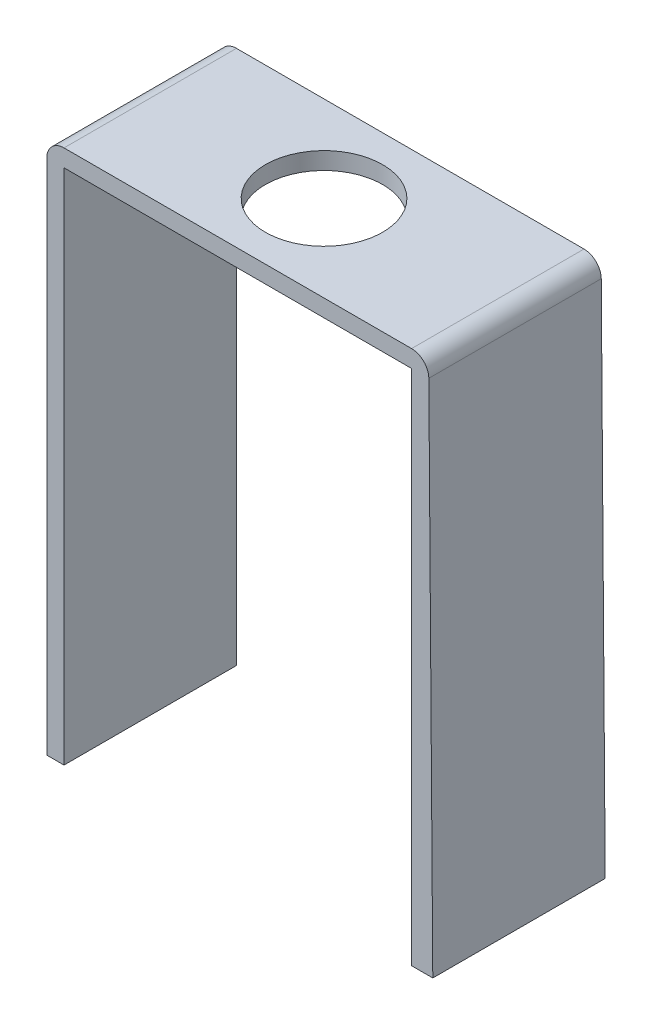
ISO-10303-21;
HEADER;
FILE_DESCRIPTION(('STEP AP214'),'2;1');
FILE_NAME('part.step','',(''),(''),'','','');
FILE_SCHEMA(('AUTOMOTIVE_DESIGN { 1 0 10303 214 1 1 1 1 }'));
ENDSEC;
DATA;
#1=APPLICATION_CONTEXT('core data for automotive mechanical design processes');
#2=APPLICATION_PROTOCOL_DEFINITION('international standard','automotive_design',2000,#1);
#3=PRODUCT_CONTEXT('',#1,'mechanical');
#4=PRODUCT('Part','Part','',(#3));
#5=PRODUCT_RELATED_PRODUCT_CATEGORY('part','',(#4));
#6=PRODUCT_DEFINITION_FORMATION('','',#4);
#7=PRODUCT_DEFINITION_CONTEXT('part definition',#1,'design');
#8=PRODUCT_DEFINITION('design','',#6,#7);
#9=PRODUCT_DEFINITION_SHAPE('','',#8);
#10=(LENGTH_UNIT() NAMED_UNIT(*) SI_UNIT(.MILLI.,.METRE.));
#11=(NAMED_UNIT(*) PLANE_ANGLE_UNIT() SI_UNIT($,.RADIAN.));
#12=(NAMED_UNIT(*) SI_UNIT($,.STERADIAN.) SOLID_ANGLE_UNIT());
#13=UNCERTAINTY_MEASURE_WITH_UNIT(LENGTH_MEASURE(1.E-05),#10,'distance_accuracy_value','');
#14=(GEOMETRIC_REPRESENTATION_CONTEXT(3) GLOBAL_UNCERTAINTY_ASSIGNED_CONTEXT((#13)) GLOBAL_UNIT_ASSIGNED_CONTEXT((#10,
#11,#12)) REPRESENTATION_CONTEXT('',''));
#15=CARTESIAN_POINT('',(0.,0.,0.));
#16=DIRECTION('',(0.,0.,1.));
#17=DIRECTION('',(1.,0.,0.));
#18=AXIS2_PLACEMENT_3D('',#15,#16,#17);
#19=CARTESIAN_POINT('',(16.9486162087082,53.2891881692384,20.));
#20=DIRECTION('',(0.,-1.,0.));
#21=DIRECTION('',(1.,0.,0.));
#22=AXIS2_PLACEMENT_3D('',#19,#20,#21);
#23=PLANE('',#22);
#24=CARTESIAN_POINT('',(-5.19376044490973,53.2891881692384,10.));
#25=DIRECTION('',(0.,1.,0.));
#26=DIRECTION('',(-1.,0.,0.));
#27=AXIS2_PLACEMENT_3D('',#24,#25,#26);
#28=CIRCLE('',#27,6.8);
#29=CARTESIAN_POINT('',(-11.9937604449097,53.2891881692384,10.));
#30=VERTEX_POINT('',#29);
#31=EDGE_CURVE('E251',#30,#30,#28,.T.);
#32=ORIENTED_EDGE('',*,*,#31,.F.);
#33=EDGE_LOOP('',(#32));
#34=FACE_BOUND('',#33,.T.);
#35=DIRECTION('',(-1.,0.,0.));
#36=VECTOR('',#35,1.);
#37=CARTESIAN_POINT('',(16.9486162087082,53.2891881692384,20.));
#38=LINE('',#37,#36);
#39=CARTESIAN_POINT('',(14.9638629014723,53.2891881692384,20.));
#40=VERTEX_POINT('',#39);
#41=CARTESIAN_POINT('',(-25.3513837912918,53.2891881692384,20.));
#42=VERTEX_POINT('',#41);
#43=EDGE_CURVE('E127',#40,#42,#38,.T.);
#44=ORIENTED_EDGE('',*,*,#43,.F.);
#45=DIRECTION('',(0.,0.,-1.));
#46=VECTOR('',#45,1.);
#47=CARTESIAN_POINT('',(14.9638629014723,53.2891881692384,20.));
#48=LINE('',#47,#46);
#49=CARTESIAN_POINT('',(14.9638629014723,53.2891881692384,0.));
#50=VERTEX_POINT('',#49);
#51=EDGE_CURVE('E191',#40,#50,#48,.T.);
#52=ORIENTED_EDGE('',*,*,#51,.T.);
#53=DIRECTION('',(-1.,0.,0.));
#54=VECTOR('',#53,1.);
#55=CARTESIAN_POINT('',(16.9486162087082,53.2891881692384,0.));
#56=LINE('',#55,#54);
#57=CARTESIAN_POINT('',(-25.3513837912918,53.2891881692384,0.));
#58=VERTEX_POINT('',#57);
#59=EDGE_CURVE('E156',#50,#58,#56,.T.);
#60=ORIENTED_EDGE('',*,*,#59,.T.);
#61=DIRECTION('',(0.,0.,-1.));
#62=VECTOR('',#61,1.);
#63=CARTESIAN_POINT('',(-25.3513837912918,53.2891881692384,20.));
#64=LINE('',#63,#62);
#65=EDGE_CURVE('E187',#58,#42,#64,.F.);
#66=ORIENTED_EDGE('',*,*,#65,.T.);
#67=EDGE_LOOP('',(#44,#52,#60,#66));
#68=FACE_BOUND('',#67,.T.);
#69=ADVANCED_FACE('F39',(#34,#68),#23,.F.);
#70=CARTESIAN_POINT('',(-27.3513837912918,53.2891881692384,20.));
#71=DIRECTION('',(1.,0.,0.));
#72=DIRECTION('',(0.,1.,0.));
#73=AXIS2_PLACEMENT_3D('',#70,#71,#72);
#74=PLANE('',#73);
#75=DIRECTION('',(0.,-1.,0.));
#76=VECTOR('',#75,1.);
#77=CARTESIAN_POINT('',(-27.3513837912918,53.2891881692384,20.));
#78=LINE('',#77,#76);
#79=CARTESIAN_POINT('',(-27.3513837912918,51.2891881692384,20.));
#80=VERTEX_POINT('',#79);
#81=CARTESIAN_POINT('',(-27.3513837912918,-8.7108118307616,20.));
#82=VERTEX_POINT('',#81);
#83=EDGE_CURVE('E116',#80,#82,#78,.T.);
#84=ORIENTED_EDGE('',*,*,#83,.F.);
#85=DIRECTION('',(0.,0.,-1.));
#86=VECTOR('',#85,1.);
#87=CARTESIAN_POINT('',(-27.3513837912918,51.2891881692384,20.));
#88=LINE('',#87,#86);
#89=CARTESIAN_POINT('',(-27.3513837912918,51.2891881692384,0.));
#90=VERTEX_POINT('',#89);
#91=EDGE_CURVE('E136',#80,#90,#88,.T.);
#92=ORIENTED_EDGE('',*,*,#91,.T.);
#93=DIRECTION('',(0.,-1.,0.));
#94=VECTOR('',#93,1.);
#95=CARTESIAN_POINT('',(-27.3513837912918,53.2891881692384,0.));
#96=LINE('',#95,#94);
#97=CARTESIAN_POINT('',(-27.3513837912918,-8.7108118307616,0.));
#98=VERTEX_POINT('',#97);
#99=EDGE_CURVE('E133',#90,#98,#96,.T.);
#100=ORIENTED_EDGE('',*,*,#99,.T.);
#101=DIRECTION('',(0.,0.,-1.));
#102=VECTOR('',#101,1.);
#103=CARTESIAN_POINT('',(-27.3513837912918,-8.7108118307616,20.));
#104=LINE('',#103,#102);
#105=EDGE_CURVE('E130',#82,#98,#104,.T.);
#106=ORIENTED_EDGE('',*,*,#105,.F.);
#107=EDGE_LOOP('',(#84,#92,#100,#106));
#108=FACE_BOUND('',#107,.T.);
#109=ADVANCED_FACE('F131',(#108),#74,.F.);
#110=CARTESIAN_POINT('',(-27.3513837912918,-8.7108118307616,20.));
#111=DIRECTION('',(0.,1.,0.));
#112=DIRECTION('',(0.,0.,1.));
#113=AXIS2_PLACEMENT_3D('',#110,#111,#112);
#114=PLANE('',#113);
#115=DIRECTION('',(1.,0.,0.));
#116=VECTOR('',#115,1.);
#117=CARTESIAN_POINT('',(-27.3513837912918,-8.7108118307616,0.));
#118=LINE('',#117,#116);
#119=CARTESIAN_POINT('',(-25.3513837912918,-8.7108118307616,0.));
#120=VERTEX_POINT('',#119);
#121=EDGE_CURVE('E159',#98,#120,#118,.T.);
#122=ORIENTED_EDGE('',*,*,#121,.T.);
#123=DIRECTION('',(0.,0.,-1.));
#124=VECTOR('',#123,1.);
#125=CARTESIAN_POINT('',(-25.3513837912918,-8.7108118307616,20.));
#126=LINE('',#125,#124);
#127=CARTESIAN_POINT('',(-25.3513837912918,-8.7108118307616,20.));
#128=VERTEX_POINT('',#127);
#129=EDGE_CURVE('E137',#128,#120,#126,.T.);
#130=ORIENTED_EDGE('',*,*,#129,.F.);
#131=DIRECTION('',(1.,0.,0.));
#132=VECTOR('',#131,1.);
#133=CARTESIAN_POINT('',(-27.3513837912918,-8.7108118307616,20.));
#134=LINE('',#133,#132);
#135=EDGE_CURVE('E120',#82,#128,#134,.T.);
#136=ORIENTED_EDGE('',*,*,#135,.F.);
#137=ORIENTED_EDGE('',*,*,#105,.T.);
#138=EDGE_LOOP('',(#122,#130,#136,#137));
#139=FACE_BOUND('',#138,.T.);
#140=ADVANCED_FACE('F139',(#139),#114,.F.);
#141=CARTESIAN_POINT('',(-25.3513837912918,-8.7108118307616,20.));
#142=DIRECTION('',(-1.,0.,0.));
#143=DIRECTION('',(0.,0.,1.));
#144=AXIS2_PLACEMENT_3D('',#141,#142,#143);
#145=PLANE('',#144);
#146=DIRECTION('',(0.,1.,0.));
#147=VECTOR('',#146,1.);
#148=CARTESIAN_POINT('',(-25.3513837912918,-8.7108118307616,0.));
#149=LINE('',#148,#147);
#150=CARTESIAN_POINT('',(-25.3513837912918,51.2891881692384,0.));
#151=VERTEX_POINT('',#150);
#152=EDGE_CURVE('E161',#120,#151,#149,.T.);
#153=ORIENTED_EDGE('',*,*,#152,.T.);
#154=DIRECTION('',(0.,0.,-1.));
#155=VECTOR('',#154,1.);
#156=CARTESIAN_POINT('',(-25.3513837912918,51.2891881692384,20.));
#157=LINE('',#156,#155);
#158=CARTESIAN_POINT('',(-25.3513837912918,51.2891881692384,20.));
#159=VERTEX_POINT('',#158);
#160=EDGE_CURVE('E179',#159,#151,#157,.T.);
#161=ORIENTED_EDGE('',*,*,#160,.F.);
#162=DIRECTION('',(0.,1.,0.));
#163=VECTOR('',#162,1.);
#164=CARTESIAN_POINT('',(-25.3513837912918,-8.7108118307616,20.));
#165=LINE('',#164,#163);
#166=EDGE_CURVE('E142',#128,#159,#165,.T.);
#167=ORIENTED_EDGE('',*,*,#166,.F.);
#168=ORIENTED_EDGE('',*,*,#129,.T.);
#169=EDGE_LOOP('',(#153,#161,#167,#168));
#170=FACE_BOUND('',#169,.T.);
#171=ADVANCED_FACE('F225',(#170),#145,.F.);
#172=CARTESIAN_POINT('',(-25.3513837912918,51.2891881692384,20.));
#173=DIRECTION('',(0.,1.,0.));
#174=DIRECTION('',(0.,0.,1.));
#175=AXIS2_PLACEMENT_3D('',#172,#173,#174);
#176=PLANE('',#175);
#177=CARTESIAN_POINT('',(-5.19376044490973,51.2891881692384,10.));
#178=DIRECTION('',(0.,1.,0.));
#179=DIRECTION('',(0.,0.,1.));
#180=AXIS2_PLACEMENT_3D('',#177,#178,#179);
#181=CIRCLE('',#180,6.8);
#182=CARTESIAN_POINT('',(-5.19376044490973,51.2891881692384,16.8));
#183=VERTEX_POINT('',#182);
#184=EDGE_CURVE('E43',#183,#183,#181,.T.);
#185=ORIENTED_EDGE('',*,*,#184,.T.);
#186=EDGE_LOOP('',(#185));
#187=FACE_BOUND('',#186,.T.);
#188=DIRECTION('',(1.,0.,0.));
#189=VECTOR('',#188,1.);
#190=CARTESIAN_POINT('',(-25.3513837912918,51.2891881692384,0.));
#191=LINE('',#190,#189);
#192=CARTESIAN_POINT('',(14.9486162087082,51.2891881692384,0.));
#193=VERTEX_POINT('',#192);
#194=EDGE_CURVE('E163',#151,#193,#191,.T.);
#195=ORIENTED_EDGE('',*,*,#194,.T.);
#196=DIRECTION('',(0.,0.,-1.));
#197=VECTOR('',#196,1.);
#198=CARTESIAN_POINT('',(14.9486162087082,51.2891881692384,20.));
#199=LINE('',#198,#197);
#200=CARTESIAN_POINT('',(14.9486162087082,51.2891881692384,20.));
#201=VERTEX_POINT('',#200);
#202=EDGE_CURVE('E176',#201,#193,#199,.T.);
#203=ORIENTED_EDGE('',*,*,#202,.F.);
#204=DIRECTION('',(1.,0.,0.));
#205=VECTOR('',#204,1.);
#206=CARTESIAN_POINT('',(-25.3513837912918,51.2891881692384,20.));
#207=LINE('',#206,#205);
#208=EDGE_CURVE('E144',#159,#201,#207,.T.);
#209=ORIENTED_EDGE('',*,*,#208,.F.);
#210=ORIENTED_EDGE('',*,*,#160,.T.);
#211=EDGE_LOOP('',(#195,#203,#209,#210));
#212=FACE_BOUND('',#211,.T.);
#213=ADVANCED_FACE('F228',(#187,#212),#176,.F.);
#214=CARTESIAN_POINT('',(14.9486162087082,51.2891881692384,20.));
#215=DIRECTION('',(1.,0.,0.));
#216=DIRECTION('',(0.,1.,0.));
#217=AXIS2_PLACEMENT_3D('',#214,#215,#216);
#218=PLANE('',#217);
#219=DIRECTION('',(0.,-1.,0.));
#220=VECTOR('',#219,1.);
#221=CARTESIAN_POINT('',(14.9486162087082,51.2891881692384,0.));
#222=LINE('',#221,#220);
#223=CARTESIAN_POINT('',(14.9486162087082,-8.7108118307616,0.));
#224=VERTEX_POINT('',#223);
#225=EDGE_CURVE('E165',#193,#224,#222,.T.);
#226=ORIENTED_EDGE('',*,*,#225,.T.);
#227=DIRECTION('',(0.,0.,-1.));
#228=VECTOR('',#227,1.);
#229=CARTESIAN_POINT('',(14.9486162087082,-8.7108118307616,20.));
#230=LINE('',#229,#228);
#231=CARTESIAN_POINT('',(14.9486162087082,-8.7108118307616,20.));
#232=VERTEX_POINT('',#231);
#233=EDGE_CURVE('E173',#232,#224,#230,.T.);
#234=ORIENTED_EDGE('',*,*,#233,.F.);
#235=DIRECTION('',(0.,-1.,0.));
#236=VECTOR('',#235,1.);
#237=CARTESIAN_POINT('',(14.9486162087082,51.2891881692384,20.));
#238=LINE('',#237,#236);
#239=EDGE_CURVE('E149',#201,#232,#238,.T.);
#240=ORIENTED_EDGE('',*,*,#239,.F.);
#241=ORIENTED_EDGE('',*,*,#202,.T.);
#242=EDGE_LOOP('',(#226,#234,#240,#241));
#243=FACE_BOUND('',#242,.T.);
#244=ADVANCED_FACE('F231',(#243),#218,.F.);
#245=CARTESIAN_POINT('',(14.9486162087082,-8.7108118307616,20.));
#246=DIRECTION('',(0.,1.,0.));
#247=DIRECTION('',(0.,0.,1.));
#248=AXIS2_PLACEMENT_3D('',#245,#246,#247);
#249=PLANE('',#248);
#250=DIRECTION('',(1.,0.,0.));
#251=VECTOR('',#250,1.);
#252=CARTESIAN_POINT('',(14.9486162087082,-8.7108118307616,0.));
#253=LINE('',#252,#251);
#254=CARTESIAN_POINT('',(17.4230791016612,-8.7108118307616,0.));
#255=VERTEX_POINT('',#254);
#256=EDGE_CURVE('E167',#224,#255,#253,.T.);
#257=ORIENTED_EDGE('',*,*,#256,.T.);
#258=DIRECTION('',(0.,0.,-1.));
#259=VECTOR('',#258,1.);
#260=CARTESIAN_POINT('',(17.4230791016612,-8.7108118307616,20.));
#261=LINE('',#260,#259);
#262=CARTESIAN_POINT('',(17.4230791016612,-8.7108118307616,20.));
#263=VERTEX_POINT('',#262);
#264=EDGE_CURVE('E155',#263,#255,#261,.T.);
#265=ORIENTED_EDGE('',*,*,#264,.F.);
#266=DIRECTION('',(1.,0.,0.));
#267=VECTOR('',#266,1.);
#268=CARTESIAN_POINT('',(14.9486162087082,-8.7108118307616,20.));
#269=LINE('',#268,#267);
#270=EDGE_CURVE('E151',#232,#263,#269,.T.);
#271=ORIENTED_EDGE('',*,*,#270,.F.);
#272=ORIENTED_EDGE('',*,*,#233,.T.);
#273=EDGE_LOOP('',(#257,#265,#271,#272));
#274=FACE_BOUND('',#273,.T.);
#275=ADVANCED_FACE('F235',(#274),#249,.F.);
#276=CARTESIAN_POINT('',(17.4230791016612,-8.7108118307616,20.));
#277=DIRECTION('',(-0.999970719933694,-0.00765240323625798,0.));
#278=DIRECTION('',(0.00765240323625798,-0.999970719933694,0.));
#279=AXIS2_PLACEMENT_3D('',#276,#277,#278);
#280=PLANE('',#279);
#281=DIRECTION('',(-0.00765240323625798,0.999970719933694,0.));
#282=VECTOR('',#281,1.);
#283=CARTESIAN_POINT('',(17.4230791016612,-8.7108118307616,0.));
#284=LINE('',#283,#282);
#285=CARTESIAN_POINT('',(16.9638043413397,51.3044929757109,0.));
#286=VERTEX_POINT('',#285);
#287=EDGE_CURVE('E169',#255,#286,#284,.T.);
#288=ORIENTED_EDGE('',*,*,#287,.T.);
#289=DIRECTION('',(0.,0.,-1.));
#290=VECTOR('',#289,1.);
#291=CARTESIAN_POINT('',(16.9638043413397,51.3044929757109,20.));
#292=LINE('',#291,#290);
#293=CARTESIAN_POINT('',(16.9638043413397,51.3044929757109,20.));
#294=VERTEX_POINT('',#293);
#295=EDGE_CURVE('E48',#286,#294,#292,.F.);
#296=ORIENTED_EDGE('',*,*,#295,.T.);
#297=DIRECTION('',(-0.00765240323625798,0.999970719933694,0.));
#298=VECTOR('',#297,1.);
#299=CARTESIAN_POINT('',(17.4230791016612,-8.7108118307616,20.));
#300=LINE('',#299,#298);
#301=EDGE_CURVE('E153',#263,#294,#300,.T.);
#302=ORIENTED_EDGE('',*,*,#301,.F.);
#303=ORIENTED_EDGE('',*,*,#264,.T.);
#304=EDGE_LOOP('',(#288,#296,#302,#303));
#305=FACE_BOUND('',#304,.T.);
#306=ADVANCED_FACE('F239',(#305),#280,.F.);
#307=CARTESIAN_POINT('',(0.,0.,20.));
#308=DIRECTION('',(0.,0.,1.));
#309=DIRECTION('',(1.,0.,0.));
#310=AXIS2_PLACEMENT_3D('',#307,#308,#309);
#311=PLANE('',#310);
#312=ORIENTED_EDGE('',*,*,#301,.T.);
#313=CARTESIAN_POINT('',(14.9638629014723,51.2891881692384,20.));
#314=DIRECTION('',(0.,0.,1.));
#315=DIRECTION('',(1.,0.,0.));
#316=AXIS2_PLACEMENT_3D('',#313,#314,#315);
#317=CIRCLE('',#316,2.);
#318=EDGE_CURVE('E11',#294,#40,#317,.T.);
#319=ORIENTED_EDGE('',*,*,#318,.T.);
#320=ORIENTED_EDGE('',*,*,#43,.T.);
#321=CARTESIAN_POINT('',(-25.3513837912918,51.2891881692384,20.));
#322=DIRECTION('',(0.,0.,1.));
#323=DIRECTION('',(1.,0.,0.));
#324=AXIS2_PLACEMENT_3D('',#321,#322,#323);
#325=CIRCLE('',#324,2.);
#326=EDGE_CURVE('E123',#42,#80,#325,.T.);
#327=ORIENTED_EDGE('',*,*,#326,.T.);
#328=ORIENTED_EDGE('',*,*,#83,.T.);
#329=ORIENTED_EDGE('',*,*,#135,.T.);
#330=ORIENTED_EDGE('',*,*,#166,.T.);
#331=ORIENTED_EDGE('',*,*,#208,.T.);
#332=ORIENTED_EDGE('',*,*,#239,.T.);
#333=ORIENTED_EDGE('',*,*,#270,.T.);
#334=EDGE_LOOP('',(#312,#319,#320,#327,#328,#329,#330,#331,#332,#333));
#335=FACE_BOUND('',#334,.T.);
#336=ADVANCED_FACE('F118',(#335),#311,.T.);
#337=CARTESIAN_POINT('',(0.,0.,0.));
#338=DIRECTION('',(0.,0.,1.));
#339=DIRECTION('',(1.,0.,0.));
#340=AXIS2_PLACEMENT_3D('',#337,#338,#339);
#341=PLANE('',#340);
#342=ORIENTED_EDGE('',*,*,#59,.F.);
#343=CARTESIAN_POINT('',(14.9638629014723,51.2891881692384,0.));
#344=DIRECTION('',(0.,0.,1.));
#345=DIRECTION('',(1.,0.,0.));
#346=AXIS2_PLACEMENT_3D('',#343,#344,#345);
#347=CIRCLE('',#346,2.);
#348=EDGE_CURVE('E62',#50,#286,#347,.F.);
#349=ORIENTED_EDGE('',*,*,#348,.T.);
#350=ORIENTED_EDGE('',*,*,#287,.F.);
#351=ORIENTED_EDGE('',*,*,#256,.F.);
#352=ORIENTED_EDGE('',*,*,#225,.F.);
#353=ORIENTED_EDGE('',*,*,#194,.F.);
#354=ORIENTED_EDGE('',*,*,#152,.F.);
#355=ORIENTED_EDGE('',*,*,#121,.F.);
#356=ORIENTED_EDGE('',*,*,#99,.F.);
#357=CARTESIAN_POINT('',(-25.3513837912918,51.2891881692384,0.));
#358=DIRECTION('',(0.,0.,1.));
#359=DIRECTION('',(1.,0.,0.));
#360=AXIS2_PLACEMENT_3D('',#357,#358,#359);
#361=CIRCLE('',#360,2.);
#362=EDGE_CURVE('E184',#90,#58,#361,.F.);
#363=ORIENTED_EDGE('',*,*,#362,.T.);
#364=EDGE_LOOP('',(#342,#349,#350,#351,#352,#353,#354,#355,#356,#363));
#365=FACE_BOUND('',#364,.T.);
#366=ADVANCED_FACE('F200',(#365),#341,.F.);
#367=CARTESIAN_POINT('',(-25.3513837912918,51.2891881692384,20.));
#368=DIRECTION('',(0.,0.,-1.));
#369=DIRECTION('',(-1.,0.,0.));
#370=AXIS2_PLACEMENT_3D('',#367,#368,#369);
#371=CYLINDRICAL_SURFACE('',#370,2.);
#372=ORIENTED_EDGE('',*,*,#326,.F.);
#373=ORIENTED_EDGE('',*,*,#65,.F.);
#374=ORIENTED_EDGE('',*,*,#362,.F.);
#375=ORIENTED_EDGE('',*,*,#91,.F.);
#376=EDGE_LOOP('',(#372,#373,#374,#375));
#377=FACE_BOUND('',#376,.T.);
#378=ADVANCED_FACE('F203',(#377),#371,.T.);
#379=CARTESIAN_POINT('',(14.9638629014723,51.2891881692384,20.));
#380=DIRECTION('',(0.,0.,-1.));
#381=DIRECTION('',(-1.,0.,0.));
#382=AXIS2_PLACEMENT_3D('',#379,#380,#381);
#383=CYLINDRICAL_SURFACE('',#382,2.);
#384=ORIENTED_EDGE('',*,*,#318,.F.);
#385=ORIENTED_EDGE('',*,*,#295,.F.);
#386=ORIENTED_EDGE('',*,*,#348,.F.);
#387=ORIENTED_EDGE('',*,*,#51,.F.);
#388=EDGE_LOOP('',(#384,#385,#386,#387));
#389=FACE_BOUND('',#388,.T.);
#390=ADVANCED_FACE('F41',(#389),#383,.T.);
#391=CARTESIAN_POINT('',(-5.19376044490973,33.2891881692384,10.));
#392=DIRECTION('',(0.,1.,0.));
#393=DIRECTION('',(-1.,0.,0.));
#394=AXIS2_PLACEMENT_3D('',#391,#392,#393);
#395=CYLINDRICAL_SURFACE('',#394,6.8);
#396=ORIENTED_EDGE('',*,*,#31,.T.);
#397=EDGE_LOOP('',(#396));
#398=FACE_BOUND('',#397,.T.);
#399=ORIENTED_EDGE('',*,*,#184,.F.);
#400=EDGE_LOOP('',(#399));
#401=FACE_BOUND('',#400,.T.);
#402=ADVANCED_FACE('F209',(#398,#401),#395,.F.);
#403=CLOSED_SHELL('',(#69,#109,#140,#171,#213,#244,#275,#306,#336,#366,#378,#390,#402));
#404=MANIFOLD_SOLID_BREP('B2',#403);
#405=ADVANCED_BREP_SHAPE_REPRESENTATION('',(#18,#404),#14);
#406=SHAPE_DEFINITION_REPRESENTATION(#9,#405);
ENDSEC;
END-ISO-10303-21;
